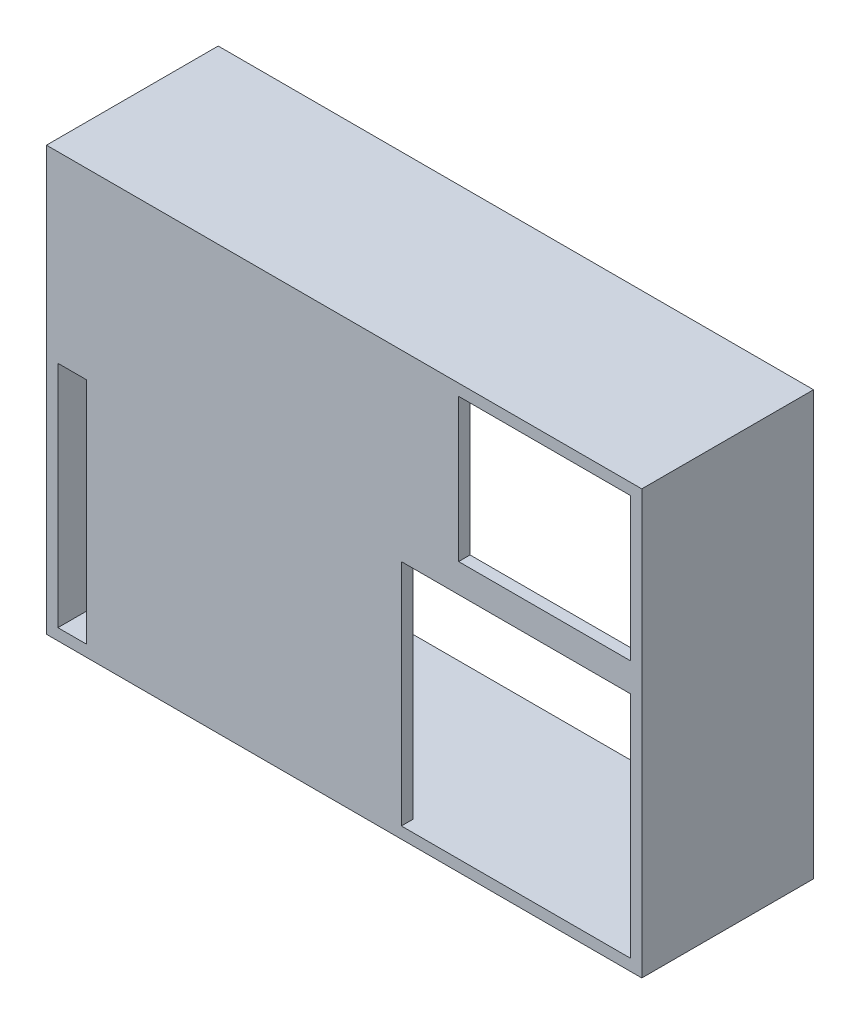
ISO-10303-21;
HEADER;
FILE_DESCRIPTION(('STEP AP214'),'2;1');
FILE_NAME('part.step','',(''),(''),'','','');
FILE_SCHEMA(('AUTOMOTIVE_DESIGN { 1 0 10303 214 1 1 1 1 }'));
ENDSEC;
DATA;
#1=APPLICATION_CONTEXT('core data for automotive mechanical design processes');
#2=APPLICATION_PROTOCOL_DEFINITION('international standard','automotive_design',2000,#1);
#3=PRODUCT_CONTEXT('',#1,'mechanical');
#4=PRODUCT('Part','Part','',(#3));
#5=PRODUCT_RELATED_PRODUCT_CATEGORY('part','',(#4));
#6=PRODUCT_DEFINITION_FORMATION('','',#4);
#7=PRODUCT_DEFINITION_CONTEXT('part definition',#1,'design');
#8=PRODUCT_DEFINITION('design','',#6,#7);
#9=PRODUCT_DEFINITION_SHAPE('','',#8);
#10=(LENGTH_UNIT() NAMED_UNIT(*) SI_UNIT(.MILLI.,.METRE.));
#11=(NAMED_UNIT(*) PLANE_ANGLE_UNIT() SI_UNIT($,.RADIAN.));
#12=(NAMED_UNIT(*) SI_UNIT($,.STERADIAN.) SOLID_ANGLE_UNIT());
#13=UNCERTAINTY_MEASURE_WITH_UNIT(LENGTH_MEASURE(1.E-05),#10,'distance_accuracy_value','');
#14=(GEOMETRIC_REPRESENTATION_CONTEXT(3) GLOBAL_UNCERTAINTY_ASSIGNED_CONTEXT((#13)) GLOBAL_UNIT_ASSIGNED_CONTEXT((#10,
#11,#12)) REPRESENTATION_CONTEXT('',''));
#15=CARTESIAN_POINT('',(0.,0.,0.));
#16=DIRECTION('',(0.,0.,1.));
#17=DIRECTION('',(1.,0.,0.));
#18=AXIS2_PLACEMENT_3D('',#15,#16,#17);
#19=CARTESIAN_POINT('',(-97.,42.,30.));
#20=DIRECTION('',(-1.,0.,0.));
#21=DIRECTION('',(0.,-1.,0.));
#22=AXIS2_PLACEMENT_3D('',#19,#20,#21);
#23=PLANE('',#22);
#24=DIRECTION('',(0.,0.,-1.));
#25=VECTOR('',#24,1.);
#26=CARTESIAN_POINT('',(-97.,42.,30.));
#27=LINE('',#26,#25);
#28=CARTESIAN_POINT('',(-97.,42.,30.));
#29=VERTEX_POINT('',#28);
#30=CARTESIAN_POINT('',(-97.,42.,28.));
#31=VERTEX_POINT('',#30);
#32=EDGE_CURVE('E245',#29,#31,#27,.T.);
#33=ORIENTED_EDGE('',*,*,#32,.T.);
#34=DIRECTION('',(0.,-1.,0.));
#35=VECTOR('',#34,1.);
#36=CARTESIAN_POINT('',(-97.,42.,28.));
#37=LINE('',#36,#35);
#38=CARTESIAN_POINT('',(-97.,1.99999999999999,28.));
#39=VERTEX_POINT('',#38);
#40=EDGE_CURVE('E187',#31,#39,#37,.T.);
#41=ORIENTED_EDGE('',*,*,#40,.T.);
#42=DIRECTION('',(0.,0.,-1.));
#43=VECTOR('',#42,1.);
#44=CARTESIAN_POINT('',(-97.,2.,30.));
#45=LINE('',#44,#43);
#46=CARTESIAN_POINT('',(-97.,2.,30.));
#47=VERTEX_POINT('',#46);
#48=EDGE_CURVE('E248',#47,#39,#45,.T.);
#49=ORIENTED_EDGE('',*,*,#48,.F.);
#50=DIRECTION('',(0.,1.,0.));
#51=VECTOR('',#50,1.);
#52=CARTESIAN_POINT('',(-97.,42.,30.));
#53=LINE('',#52,#51);
#54=EDGE_CURVE('E236',#47,#29,#53,.T.);
#55=ORIENTED_EDGE('',*,*,#54,.T.);
#56=EDGE_LOOP('',(#33,#41,#49,#55));
#57=FACE_BOUND('',#56,.T.);
#58=ADVANCED_FACE('F33',(#57),#23,.T.);
#59=CARTESIAN_POINT('',(-102.,42.,30.));
#60=DIRECTION('',(0.,-1.,0.));
#61=DIRECTION('',(0.,0.,-1.));
#62=AXIS2_PLACEMENT_3D('',#59,#60,#61);
#63=PLANE('',#62);
#64=DIRECTION('',(0.,0.,-1.));
#65=VECTOR('',#64,1.);
#66=CARTESIAN_POINT('',(-102.,42.,30.));
#67=LINE('',#66,#65);
#68=CARTESIAN_POINT('',(-102.,42.,30.));
#69=VERTEX_POINT('',#68);
#70=CARTESIAN_POINT('',(-102.,42.,28.));
#71=VERTEX_POINT('',#70);
#72=EDGE_CURVE('E241',#69,#71,#67,.T.);
#73=ORIENTED_EDGE('',*,*,#72,.T.);
#74=DIRECTION('',(1.,0.,0.));
#75=VECTOR('',#74,1.);
#76=CARTESIAN_POINT('',(-102.,42.,28.));
#77=LINE('',#76,#75);
#78=EDGE_CURVE('E157',#71,#31,#77,.T.);
#79=ORIENTED_EDGE('',*,*,#78,.T.);
#80=ORIENTED_EDGE('',*,*,#32,.F.);
#81=DIRECTION('',(-1.,0.,0.));
#82=VECTOR('',#81,1.);
#83=CARTESIAN_POINT('',(-102.,42.,30.));
#84=LINE('',#83,#82);
#85=EDGE_CURVE('E239',#29,#69,#84,.T.);
#86=ORIENTED_EDGE('',*,*,#85,.T.);
#87=EDGE_LOOP('',(#73,#79,#80,#86));
#88=FACE_BOUND('',#87,.T.);
#89=ADVANCED_FACE('F307',(#88),#63,.T.);
#90=CARTESIAN_POINT('',(-42.,42.,30.));
#91=DIRECTION('',(1.,0.,0.));
#92=DIRECTION('',(0.,0.,-1.));
#93=AXIS2_PLACEMENT_3D('',#90,#91,#92);
#94=PLANE('',#93);
#95=DIRECTION('',(0.,0.,-1.));
#96=VECTOR('',#95,1.);
#97=CARTESIAN_POINT('',(-42.,2.,30.));
#98=LINE('',#97,#96);
#99=CARTESIAN_POINT('',(-42.,2.,30.));
#100=VERTEX_POINT('',#99);
#101=CARTESIAN_POINT('',(-42.,1.99999999999999,28.));
#102=VERTEX_POINT('',#101);
#103=EDGE_CURVE('E228',#100,#102,#98,.T.);
#104=ORIENTED_EDGE('',*,*,#103,.T.);
#105=DIRECTION('',(0.,1.,0.));
#106=VECTOR('',#105,1.);
#107=CARTESIAN_POINT('',(-42.,42.,28.));
#108=LINE('',#107,#106);
#109=CARTESIAN_POINT('',(-42.,42.,28.));
#110=VERTEX_POINT('',#109);
#111=EDGE_CURVE('E183',#102,#110,#108,.T.);
#112=ORIENTED_EDGE('',*,*,#111,.T.);
#113=DIRECTION('',(0.,0.,-1.));
#114=VECTOR('',#113,1.);
#115=CARTESIAN_POINT('',(-42.,42.,30.));
#116=LINE('',#115,#114);
#117=CARTESIAN_POINT('',(-42.,42.,30.));
#118=VERTEX_POINT('',#117);
#119=EDGE_CURVE('E218',#118,#110,#116,.T.);
#120=ORIENTED_EDGE('',*,*,#119,.F.);
#121=DIRECTION('',(0.,-1.,0.));
#122=VECTOR('',#121,1.);
#123=CARTESIAN_POINT('',(-42.,42.,30.));
#124=LINE('',#123,#122);
#125=EDGE_CURVE('E209',#118,#100,#124,.T.);
#126=ORIENTED_EDGE('',*,*,#125,.T.);
#127=EDGE_LOOP('',(#104,#112,#120,#126));
#128=FACE_BOUND('',#127,.T.);
#129=ADVANCED_FACE('F313',(#128),#94,.T.);
#130=CARTESIAN_POINT('',(-42.,42.,30.));
#131=DIRECTION('',(0.,-1.,0.));
#132=DIRECTION('',(1.,0.,0.));
#133=AXIS2_PLACEMENT_3D('',#130,#131,#132);
#134=PLANE('',#133);
#135=ORIENTED_EDGE('',*,*,#119,.T.);
#136=DIRECTION('',(1.,0.,0.));
#137=VECTOR('',#136,1.);
#138=CARTESIAN_POINT('',(-42.,42.,28.));
#139=LINE('',#138,#137);
#140=CARTESIAN_POINT('',(-2.00000000000001,42.,28.));
#141=VERTEX_POINT('',#140);
#142=EDGE_CURVE('E180',#110,#141,#139,.T.);
#143=ORIENTED_EDGE('',*,*,#142,.T.);
#144=DIRECTION('',(0.,0.,-1.));
#145=VECTOR('',#144,1.);
#146=CARTESIAN_POINT('',(-1.99999999999999,42.,30.));
#147=LINE('',#146,#145);
#148=CARTESIAN_POINT('',(-1.99999999999999,42.,30.));
#149=VERTEX_POINT('',#148);
#150=EDGE_CURVE('E222',#149,#141,#147,.T.);
#151=ORIENTED_EDGE('',*,*,#150,.F.);
#152=DIRECTION('',(-1.,0.,0.));
#153=VECTOR('',#152,1.);
#154=CARTESIAN_POINT('',(-42.,42.,30.));
#155=LINE('',#154,#153);
#156=EDGE_CURVE('E216',#149,#118,#155,.T.);
#157=ORIENTED_EDGE('',*,*,#156,.T.);
#158=EDGE_LOOP('',(#135,#143,#151,#157));
#159=FACE_BOUND('',#158,.T.);
#160=ADVANCED_FACE('F433',(#159),#134,.T.);
#161=CARTESIAN_POINT('',(-32.,72.,30.));
#162=DIRECTION('',(1.,0.,0.));
#163=DIRECTION('',(0.,0.,-1.));
#164=AXIS2_PLACEMENT_3D('',#161,#162,#163);
#165=PLANE('',#164);
#166=DIRECTION('',(0.,0.,-1.));
#167=VECTOR('',#166,1.);
#168=CARTESIAN_POINT('',(-32.,47.,30.));
#169=LINE('',#168,#167);
#170=CARTESIAN_POINT('',(-32.,47.,30.));
#171=VERTEX_POINT('',#170);
#172=CARTESIAN_POINT('',(-32.,47.,28.));
#173=VERTEX_POINT('',#172);
#174=EDGE_CURVE('E205',#171,#173,#169,.T.);
#175=ORIENTED_EDGE('',*,*,#174,.T.);
#176=DIRECTION('',(0.,1.,0.));
#177=VECTOR('',#176,1.);
#178=CARTESIAN_POINT('',(-32.,72.,28.));
#179=LINE('',#178,#177);
#180=CARTESIAN_POINT('',(-32.,72.,28.));
#181=VERTEX_POINT('',#180);
#182=EDGE_CURVE('E48',#173,#181,#179,.T.);
#183=ORIENTED_EDGE('',*,*,#182,.T.);
#184=DIRECTION('',(0.,0.,-1.));
#185=VECTOR('',#184,1.);
#186=CARTESIAN_POINT('',(-32.,72.,30.));
#187=LINE('',#186,#185);
#188=CARTESIAN_POINT('',(-32.,72.,30.));
#189=VERTEX_POINT('',#188);
#190=EDGE_CURVE('E174',#189,#181,#187,.T.);
#191=ORIENTED_EDGE('',*,*,#190,.F.);
#192=DIRECTION('',(0.,-1.,0.));
#193=VECTOR('',#192,1.);
#194=CARTESIAN_POINT('',(-32.,72.,30.));
#195=LINE('',#194,#193);
#196=EDGE_CURVE('E191',#189,#171,#195,.T.);
#197=ORIENTED_EDGE('',*,*,#196,.T.);
#198=EDGE_LOOP('',(#175,#183,#191,#197));
#199=FACE_BOUND('',#198,.T.);
#200=ADVANCED_FACE('F426',(#199),#165,.T.);
#201=CARTESIAN_POINT('',(-32.,47.,30.));
#202=DIRECTION('',(0.,1.,0.));
#203=DIRECTION('',(0.,0.,1.));
#204=AXIS2_PLACEMENT_3D('',#201,#202,#203);
#205=PLANE('',#204);
#206=DIRECTION('',(0.,0.,-1.));
#207=VECTOR('',#206,1.);
#208=CARTESIAN_POINT('',(-2.,47.,30.));
#209=LINE('',#208,#207);
#210=CARTESIAN_POINT('',(-2.,47.,30.));
#211=VERTEX_POINT('',#210);
#212=CARTESIAN_POINT('',(-2.00000000000001,47.,28.));
#213=VERTEX_POINT('',#212);
#214=EDGE_CURVE('E202',#211,#213,#209,.T.);
#215=ORIENTED_EDGE('',*,*,#214,.T.);
#216=DIRECTION('',(-1.,0.,0.));
#217=VECTOR('',#216,1.);
#218=CARTESIAN_POINT('',(-32.,47.,28.));
#219=LINE('',#218,#217);
#220=EDGE_CURVE('E169',#213,#173,#219,.T.);
#221=ORIENTED_EDGE('',*,*,#220,.T.);
#222=ORIENTED_EDGE('',*,*,#174,.F.);
#223=DIRECTION('',(1.,0.,0.));
#224=VECTOR('',#223,1.);
#225=CARTESIAN_POINT('',(-32.,47.,30.));
#226=LINE('',#225,#224);
#227=EDGE_CURVE('E193',#171,#211,#226,.T.);
#228=ORIENTED_EDGE('',*,*,#227,.T.);
#229=EDGE_LOOP('',(#215,#221,#222,#228));
#230=FACE_BOUND('',#229,.T.);
#231=ADVANCED_FACE('F327',(#230),#205,.T.);
#232=CARTESIAN_POINT('',(0.,0.,30.));
#233=DIRECTION('',(0.,0.,1.));
#234=DIRECTION('',(1.,0.,0.));
#235=AXIS2_PLACEMENT_3D('',#232,#233,#234);
#236=PLANE('',#235);
#237=DIRECTION('',(0.,1.,0.));
#238=VECTOR('',#237,1.);
#239=CARTESIAN_POINT('',(0.,0.,30.));
#240=LINE('',#239,#238);
#241=CARTESIAN_POINT('',(0.,0.,30.));
#242=VERTEX_POINT('',#241);
#243=CARTESIAN_POINT('',(0.,74.,30.));
#244=VERTEX_POINT('',#243);
#245=EDGE_CURVE('E254',#242,#244,#240,.T.);
#246=ORIENTED_EDGE('',*,*,#245,.T.);
#247=DIRECTION('',(-1.,0.,0.));
#248=VECTOR('',#247,1.);
#249=CARTESIAN_POINT('',(0.,74.,30.));
#250=LINE('',#249,#248);
#251=CARTESIAN_POINT('',(-104.,74.,30.));
#252=VERTEX_POINT('',#251);
#253=EDGE_CURVE('E257',#244,#252,#250,.T.);
#254=ORIENTED_EDGE('',*,*,#253,.T.);
#255=DIRECTION('',(0.,-1.,0.));
#256=VECTOR('',#255,1.);
#257=CARTESIAN_POINT('',(-104.,0.,30.));
#258=LINE('',#257,#256);
#259=CARTESIAN_POINT('',(-104.,0.,30.));
#260=VERTEX_POINT('',#259);
#261=EDGE_CURVE('E260',#252,#260,#258,.T.);
#262=ORIENTED_EDGE('',*,*,#261,.T.);
#263=DIRECTION('',(1.,0.,0.));
#264=VECTOR('',#263,1.);
#265=CARTESIAN_POINT('',(0.,0.,30.));
#266=LINE('',#265,#264);
#267=EDGE_CURVE('E262',#260,#242,#266,.T.);
#268=ORIENTED_EDGE('',*,*,#267,.T.);
#269=EDGE_LOOP('',(#246,#254,#262,#268));
#270=FACE_BOUND('',#269,.T.);
#271=DIRECTION('',(1.,0.,0.));
#272=VECTOR('',#271,1.);
#273=CARTESIAN_POINT('',(-102.,2.,30.));
#274=LINE('',#273,#272);
#275=CARTESIAN_POINT('',(-102.,2.,30.));
#276=VERTEX_POINT('',#275);
#277=EDGE_CURVE('E233',#276,#47,#274,.T.);
#278=ORIENTED_EDGE('',*,*,#277,.F.);
#279=DIRECTION('',(0.,-1.,0.));
#280=VECTOR('',#279,1.);
#281=CARTESIAN_POINT('',(-102.,42.,30.));
#282=LINE('',#281,#280);
#283=EDGE_CURVE('E231',#69,#276,#282,.T.);
#284=ORIENTED_EDGE('',*,*,#283,.F.);
#285=ORIENTED_EDGE('',*,*,#85,.F.);
#286=ORIENTED_EDGE('',*,*,#54,.F.);
#287=EDGE_LOOP('',(#278,#284,#285,#286));
#288=FACE_BOUND('',#287,.T.);
#289=DIRECTION('',(1.,0.,0.));
#290=VECTOR('',#289,1.);
#291=CARTESIAN_POINT('',(-42.,2.,30.));
#292=LINE('',#291,#290);
#293=CARTESIAN_POINT('',(-2.,2.,30.));
#294=VERTEX_POINT('',#293);
#295=EDGE_CURVE('E211',#100,#294,#292,.T.);
#296=ORIENTED_EDGE('',*,*,#295,.F.);
#297=ORIENTED_EDGE('',*,*,#125,.F.);
#298=ORIENTED_EDGE('',*,*,#156,.F.);
#299=DIRECTION('',(0.,1.,0.));
#300=VECTOR('',#299,1.);
#301=CARTESIAN_POINT('',(-1.99999999999999,42.,30.));
#302=LINE('',#301,#300);
#303=EDGE_CURVE('E213',#294,#149,#302,.T.);
#304=ORIENTED_EDGE('',*,*,#303,.F.);
#305=EDGE_LOOP('',(#296,#297,#298,#304));
#306=FACE_BOUND('',#305,.T.);
#307=ORIENTED_EDGE('',*,*,#227,.F.);
#308=ORIENTED_EDGE('',*,*,#196,.F.);
#309=DIRECTION('',(-1.,0.,0.));
#310=VECTOR('',#309,1.);
#311=CARTESIAN_POINT('',(-32.,72.,30.));
#312=LINE('',#311,#310);
#313=CARTESIAN_POINT('',(-2.,72.,30.));
#314=VERTEX_POINT('',#313);
#315=EDGE_CURVE('E197',#314,#189,#312,.T.);
#316=ORIENTED_EDGE('',*,*,#315,.F.);
#317=DIRECTION('',(0.,1.,0.));
#318=VECTOR('',#317,1.);
#319=CARTESIAN_POINT('',(-2.,72.,30.));
#320=LINE('',#319,#318);
#321=EDGE_CURVE('E195',#211,#314,#320,.T.);
#322=ORIENTED_EDGE('',*,*,#321,.F.);
#323=EDGE_LOOP('',(#307,#308,#316,#322));
#324=FACE_BOUND('',#323,.T.);
#325=ADVANCED_FACE('F297',(#270,#288,#306,#324),#236,.T.);
#326=CARTESIAN_POINT('',(0.,0.,0.));
#327=DIRECTION('',(0.,0.,1.));
#328=DIRECTION('',(1.,0.,0.));
#329=AXIS2_PLACEMENT_3D('',#326,#327,#328);
#330=PLANE('',#329);
#331=DIRECTION('',(0.,1.,0.));
#332=VECTOR('',#331,1.);
#333=CARTESIAN_POINT('',(0.,0.,0.));
#334=LINE('',#333,#332);
#335=CARTESIAN_POINT('',(0.,0.,0.));
#336=VERTEX_POINT('',#335);
#337=CARTESIAN_POINT('',(0.,74.,0.));
#338=VERTEX_POINT('',#337);
#339=EDGE_CURVE('E253',#336,#338,#334,.T.);
#340=ORIENTED_EDGE('',*,*,#339,.F.);
#341=DIRECTION('',(1.,0.,0.));
#342=VECTOR('',#341,1.);
#343=CARTESIAN_POINT('',(0.,0.,0.));
#344=LINE('',#343,#342);
#345=CARTESIAN_POINT('',(-104.,0.,0.));
#346=VERTEX_POINT('',#345);
#347=EDGE_CURVE('E258',#346,#336,#344,.T.);
#348=ORIENTED_EDGE('',*,*,#347,.F.);
#349=DIRECTION('',(0.,-1.,0.));
#350=VECTOR('',#349,1.);
#351=CARTESIAN_POINT('',(-104.,0.,0.));
#352=LINE('',#351,#350);
#353=CARTESIAN_POINT('',(-104.,74.,0.));
#354=VERTEX_POINT('',#353);
#355=EDGE_CURVE('E269',#354,#346,#352,.T.);
#356=ORIENTED_EDGE('',*,*,#355,.F.);
#357=DIRECTION('',(-1.,0.,0.));
#358=VECTOR('',#357,1.);
#359=CARTESIAN_POINT('',(0.,74.,0.));
#360=LINE('',#359,#358);
#361=EDGE_CURVE('E267',#338,#354,#360,.T.);
#362=ORIENTED_EDGE('',*,*,#361,.F.);
#363=EDGE_LOOP('',(#340,#348,#356,#362));
#364=FACE_BOUND('',#363,.T.);
#365=DIRECTION('',(0.,1.,0.));
#366=VECTOR('',#365,1.);
#367=CARTESIAN_POINT('',(-1.99999999999999,42.,0.));
#368=LINE('',#367,#366);
#369=CARTESIAN_POINT('',(-2.,2.,0.));
#370=VERTEX_POINT('',#369);
#371=CARTESIAN_POINT('',(-2.,72.,0.));
#372=VERTEX_POINT('',#371);
#373=EDGE_CURVE('E208',#370,#372,#368,.T.);
#374=ORIENTED_EDGE('',*,*,#373,.T.);
#375=DIRECTION('',(-1.,0.,0.));
#376=VECTOR('',#375,1.);
#377=CARTESIAN_POINT('',(-32.,72.,0.));
#378=LINE('',#377,#376);
#379=CARTESIAN_POINT('',(-102.,72.,0.));
#380=VERTEX_POINT('',#379);
#381=EDGE_CURVE('E190',#372,#380,#378,.T.);
#382=ORIENTED_EDGE('',*,*,#381,.T.);
#383=DIRECTION('',(0.,-1.,0.));
#384=VECTOR('',#383,1.);
#385=CARTESIAN_POINT('',(-102.,42.,0.));
#386=LINE('',#385,#384);
#387=CARTESIAN_POINT('',(-102.,2.,0.));
#388=VERTEX_POINT('',#387);
#389=EDGE_CURVE('E167',#380,#388,#386,.T.);
#390=ORIENTED_EDGE('',*,*,#389,.T.);
#391=DIRECTION('',(1.,0.,0.));
#392=VECTOR('',#391,1.);
#393=CARTESIAN_POINT('',(-102.,2.,0.));
#394=LINE('',#393,#392);
#395=EDGE_CURVE('E234',#388,#370,#394,.T.);
#396=ORIENTED_EDGE('',*,*,#395,.T.);
#397=EDGE_LOOP('',(#374,#382,#390,#396));
#398=FACE_BOUND('',#397,.T.);
#399=ADVANCED_FACE('F287',(#364,#398),#330,.F.);
#400=CARTESIAN_POINT('',(0.,0.,30.));
#401=DIRECTION('',(-1.,0.,0.));
#402=DIRECTION('',(0.,-1.,0.));
#403=AXIS2_PLACEMENT_3D('',#400,#401,#402);
#404=PLANE('',#403);
#405=ORIENTED_EDGE('',*,*,#339,.T.);
#406=DIRECTION('',(0.,0.,-1.));
#407=VECTOR('',#406,1.);
#408=CARTESIAN_POINT('',(0.,74.,30.));
#409=LINE('',#408,#407);
#410=EDGE_CURVE('E11',#244,#338,#409,.T.);
#411=ORIENTED_EDGE('',*,*,#410,.F.);
#412=ORIENTED_EDGE('',*,*,#245,.F.);
#413=DIRECTION('',(0.,0.,-1.));
#414=VECTOR('',#413,1.);
#415=CARTESIAN_POINT('',(0.,0.,30.));
#416=LINE('',#415,#414);
#417=EDGE_CURVE('E264',#242,#336,#416,.T.);
#418=ORIENTED_EDGE('',*,*,#417,.T.);
#419=EDGE_LOOP('',(#405,#411,#412,#418));
#420=FACE_BOUND('',#419,.T.);
#421=ADVANCED_FACE('F35',(#420),#404,.F.);
#422=CARTESIAN_POINT('',(0.,74.,30.));
#423=DIRECTION('',(0.,-1.,0.));
#424=DIRECTION('',(1.,0.,0.));
#425=AXIS2_PLACEMENT_3D('',#422,#423,#424);
#426=PLANE('',#425);
#427=ORIENTED_EDGE('',*,*,#361,.T.);
#428=DIRECTION('',(0.,0.,-1.));
#429=VECTOR('',#428,1.);
#430=CARTESIAN_POINT('',(-104.,74.,30.));
#431=LINE('',#430,#429);
#432=EDGE_CURVE('E41',#252,#354,#431,.T.);
#433=ORIENTED_EDGE('',*,*,#432,.F.);
#434=ORIENTED_EDGE('',*,*,#253,.F.);
#435=ORIENTED_EDGE('',*,*,#410,.T.);
#436=EDGE_LOOP('',(#427,#433,#434,#435));
#437=FACE_BOUND('',#436,.T.);
#438=ADVANCED_FACE('F299',(#437),#426,.F.);
#439=CARTESIAN_POINT('',(-104.,0.,30.));
#440=DIRECTION('',(1.,0.,0.));
#441=DIRECTION('',(0.,0.,-1.));
#442=AXIS2_PLACEMENT_3D('',#439,#440,#441);
#443=PLANE('',#442);
#444=ORIENTED_EDGE('',*,*,#355,.T.);
#445=DIRECTION('',(0.,0.,-1.));
#446=VECTOR('',#445,1.);
#447=CARTESIAN_POINT('',(-104.,0.,30.));
#448=LINE('',#447,#446);
#449=EDGE_CURVE('E274',#260,#346,#448,.T.);
#450=ORIENTED_EDGE('',*,*,#449,.F.);
#451=ORIENTED_EDGE('',*,*,#261,.F.);
#452=ORIENTED_EDGE('',*,*,#432,.T.);
#453=EDGE_LOOP('',(#444,#450,#451,#452));
#454=FACE_BOUND('',#453,.T.);
#455=ADVANCED_FACE('F281',(#454),#443,.F.);
#456=CARTESIAN_POINT('',(0.,0.,30.));
#457=DIRECTION('',(0.,1.,0.));
#458=DIRECTION('',(-1.,0.,0.));
#459=AXIS2_PLACEMENT_3D('',#456,#457,#458);
#460=PLANE('',#459);
#461=ORIENTED_EDGE('',*,*,#347,.T.);
#462=ORIENTED_EDGE('',*,*,#417,.F.);
#463=ORIENTED_EDGE('',*,*,#267,.F.);
#464=ORIENTED_EDGE('',*,*,#449,.T.);
#465=EDGE_LOOP('',(#461,#462,#463,#464));
#466=FACE_BOUND('',#465,.T.);
#467=ADVANCED_FACE('F291',(#466),#460,.F.);
#468=CARTESIAN_POINT('',(-102.,42.,30.));
#469=DIRECTION('',(1.,0.,0.));
#470=DIRECTION('',(0.,0.,-1.));
#471=AXIS2_PLACEMENT_3D('',#468,#469,#470);
#472=PLANE('',#471);
#473=DIRECTION('',(0.,1.,0.));
#474=VECTOR('',#473,1.);
#475=CARTESIAN_POINT('',(-102.,72.,28.));
#476=LINE('',#475,#474);
#477=CARTESIAN_POINT('',(-102.,72.,28.));
#478=VERTEX_POINT('',#477);
#479=EDGE_CURVE('E151',#71,#478,#476,.T.);
#480=ORIENTED_EDGE('',*,*,#479,.F.);
#481=ORIENTED_EDGE('',*,*,#72,.F.);
#482=ORIENTED_EDGE('',*,*,#283,.T.);
#483=DIRECTION('',(0.,0.,-1.));
#484=VECTOR('',#483,1.);
#485=CARTESIAN_POINT('',(-102.,2.,30.));
#486=LINE('',#485,#484);
#487=EDGE_CURVE('E251',#276,#388,#486,.T.);
#488=ORIENTED_EDGE('',*,*,#487,.T.);
#489=ORIENTED_EDGE('',*,*,#389,.F.);
#490=DIRECTION('',(0.,0.,-1.));
#491=VECTOR('',#490,1.);
#492=CARTESIAN_POINT('',(-102.,72.,28.));
#493=LINE('',#492,#491);
#494=EDGE_CURVE('E164',#478,#380,#493,.T.);
#495=ORIENTED_EDGE('',*,*,#494,.F.);
#496=EDGE_LOOP('',(#480,#481,#482,#488,#489,#495));
#497=FACE_BOUND('',#496,.T.);
#498=ADVANCED_FACE('F165',(#497),#472,.T.);
#499=CARTESIAN_POINT('',(-102.,2.,30.));
#500=DIRECTION('',(0.,1.,0.));
#501=DIRECTION('',(0.,0.,1.));
#502=AXIS2_PLACEMENT_3D('',#499,#500,#501);
#503=PLANE('',#502);
#504=ORIENTED_EDGE('',*,*,#395,.F.);
#505=ORIENTED_EDGE('',*,*,#487,.F.);
#506=ORIENTED_EDGE('',*,*,#277,.T.);
#507=ORIENTED_EDGE('',*,*,#48,.T.);
#508=DIRECTION('',(-1.,0.,0.));
#509=VECTOR('',#508,1.);
#510=CARTESIAN_POINT('',(-2.00000000000002,1.99999999999999,28.));
#511=LINE('',#510,#509);
#512=EDGE_CURVE('E161',#102,#39,#511,.T.);
#513=ORIENTED_EDGE('',*,*,#512,.F.);
#514=ORIENTED_EDGE('',*,*,#103,.F.);
#515=ORIENTED_EDGE('',*,*,#295,.T.);
#516=DIRECTION('',(0.,0.,-1.));
#517=VECTOR('',#516,1.);
#518=CARTESIAN_POINT('',(-2.,2.,30.));
#519=LINE('',#518,#517);
#520=EDGE_CURVE('E225',#294,#370,#519,.T.);
#521=ORIENTED_EDGE('',*,*,#520,.T.);
#522=EDGE_LOOP('',(#504,#505,#506,#507,#513,#514,#515,#521));
#523=FACE_BOUND('',#522,.T.);
#524=ADVANCED_FACE('F318',(#523),#503,.T.);
#525=CARTESIAN_POINT('',(-1.99999999999999,42.,30.));
#526=DIRECTION('',(-1.,0.,0.));
#527=DIRECTION('',(0.,-1.,0.));
#528=AXIS2_PLACEMENT_3D('',#525,#526,#527);
#529=PLANE('',#528);
#530=ORIENTED_EDGE('',*,*,#373,.F.);
#531=ORIENTED_EDGE('',*,*,#520,.F.);
#532=ORIENTED_EDGE('',*,*,#303,.T.);
#533=ORIENTED_EDGE('',*,*,#150,.T.);
#534=DIRECTION('',(0.,-1.,0.));
#535=VECTOR('',#534,1.);
#536=CARTESIAN_POINT('',(-2.00000000000001,72.,28.));
#537=LINE('',#536,#535);
#538=EDGE_CURVE('E488',#213,#141,#537,.T.);
#539=ORIENTED_EDGE('',*,*,#538,.F.);
#540=ORIENTED_EDGE('',*,*,#214,.F.);
#541=ORIENTED_EDGE('',*,*,#321,.T.);
#542=DIRECTION('',(0.,0.,-1.));
#543=VECTOR('',#542,1.);
#544=CARTESIAN_POINT('',(-2.,72.,30.));
#545=LINE('',#544,#543);
#546=EDGE_CURVE('E56',#314,#372,#545,.T.);
#547=ORIENTED_EDGE('',*,*,#546,.T.);
#548=EDGE_LOOP('',(#530,#531,#532,#533,#539,#540,#541,#547));
#549=FACE_BOUND('',#548,.T.);
#550=ADVANCED_FACE('F321',(#549),#529,.T.);
#551=CARTESIAN_POINT('',(-32.,72.,30.));
#552=DIRECTION('',(0.,-1.,0.));
#553=DIRECTION('',(0.,0.,-1.));
#554=AXIS2_PLACEMENT_3D('',#551,#552,#553);
#555=PLANE('',#554);
#556=ORIENTED_EDGE('',*,*,#381,.F.);
#557=ORIENTED_EDGE('',*,*,#546,.F.);
#558=ORIENTED_EDGE('',*,*,#315,.T.);
#559=ORIENTED_EDGE('',*,*,#190,.T.);
#560=DIRECTION('',(1.,0.,0.));
#561=VECTOR('',#560,1.);
#562=CARTESIAN_POINT('',(-2.00000000000001,72.,28.));
#563=LINE('',#562,#561);
#564=EDGE_CURVE('E155',#478,#181,#563,.T.);
#565=ORIENTED_EDGE('',*,*,#564,.F.);
#566=ORIENTED_EDGE('',*,*,#494,.T.);
#567=EDGE_LOOP('',(#556,#557,#558,#559,#565,#566));
#568=FACE_BOUND('',#567,.T.);
#569=ADVANCED_FACE('F172',(#568),#555,.T.);
#570=CARTESIAN_POINT('',(0.,0.,28.));
#571=DIRECTION('',(0.,0.,-1.));
#572=DIRECTION('',(-1.,0.,0.));
#573=AXIS2_PLACEMENT_3D('',#570,#571,#572);
#574=PLANE('',#573);
#575=ORIENTED_EDGE('',*,*,#78,.F.);
#576=ORIENTED_EDGE('',*,*,#479,.T.);
#577=ORIENTED_EDGE('',*,*,#564,.T.);
#578=ORIENTED_EDGE('',*,*,#182,.F.);
#579=ORIENTED_EDGE('',*,*,#220,.F.);
#580=ORIENTED_EDGE('',*,*,#538,.T.);
#581=ORIENTED_EDGE('',*,*,#142,.F.);
#582=ORIENTED_EDGE('',*,*,#111,.F.);
#583=ORIENTED_EDGE('',*,*,#512,.T.);
#584=ORIENTED_EDGE('',*,*,#40,.F.);
#585=EDGE_LOOP('',(#575,#576,#577,#578,#579,#580,#581,#582,#583,#584));
#586=FACE_BOUND('',#585,.T.);
#587=ADVANCED_FACE('F153',(#586),#574,.T.);
#588=CLOSED_SHELL('',(#58,#89,#129,#160,#200,#231,#325,#399,#421,#438,#455,#467,#498,#524,#550,
#569,#587));
#589=MANIFOLD_SOLID_BREP('B2',#588);
#590=ADVANCED_BREP_SHAPE_REPRESENTATION('',(#18,#589),#14);
#591=SHAPE_DEFINITION_REPRESENTATION(#9,#590);
ENDSEC;
END-ISO-10303-21;
